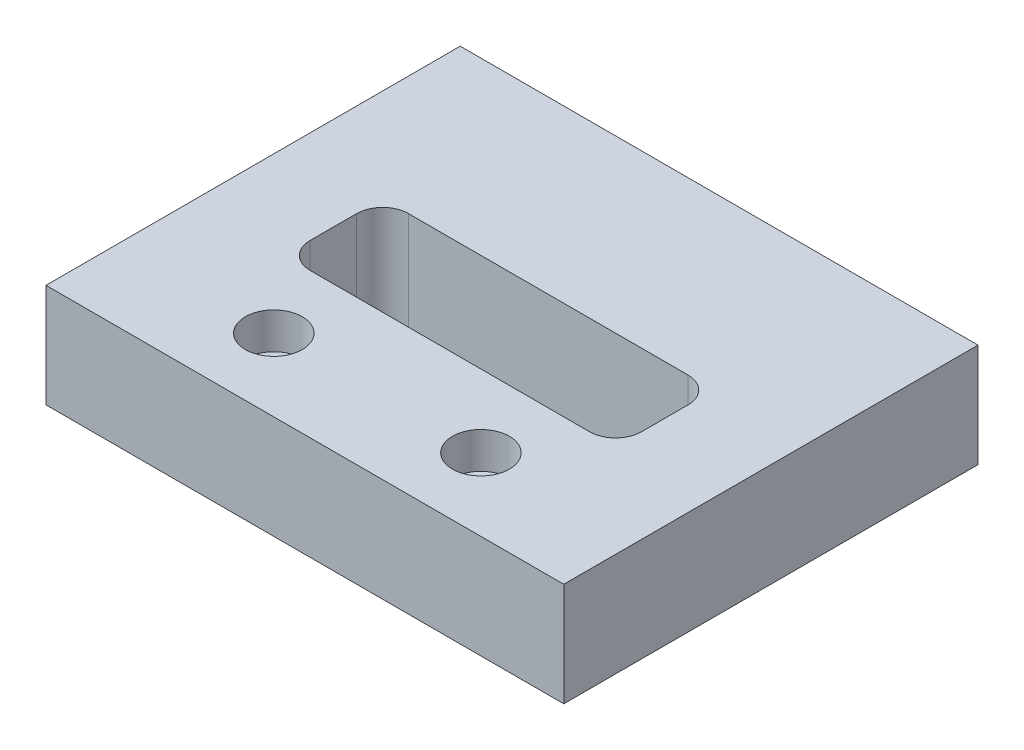
ISO-10303-21;
HEADER;
FILE_DESCRIPTION(('STEP AP214'),'2;1');
FILE_NAME('part.step','',(''),(''),'','','');
FILE_SCHEMA(('AUTOMOTIVE_DESIGN { 1 0 10303 214 1 1 1 1 }'));
ENDSEC;
DATA;
#1=APPLICATION_CONTEXT('core data for automotive mechanical design processes');
#2=APPLICATION_PROTOCOL_DEFINITION('international standard','automotive_design',2000,#1);
#3=PRODUCT_CONTEXT('',#1,'mechanical');
#4=PRODUCT('Part','Part','',(#3));
#5=PRODUCT_RELATED_PRODUCT_CATEGORY('part','',(#4));
#6=PRODUCT_DEFINITION_FORMATION('','',#4);
#7=PRODUCT_DEFINITION_CONTEXT('part definition',#1,'design');
#8=PRODUCT_DEFINITION('design','',#6,#7);
#9=PRODUCT_DEFINITION_SHAPE('','',#8);
#10=(LENGTH_UNIT() NAMED_UNIT(*) SI_UNIT(.MILLI.,.METRE.));
#11=(NAMED_UNIT(*) PLANE_ANGLE_UNIT() SI_UNIT($,.RADIAN.));
#12=(NAMED_UNIT(*) SI_UNIT($,.STERADIAN.) SOLID_ANGLE_UNIT());
#13=UNCERTAINTY_MEASURE_WITH_UNIT(LENGTH_MEASURE(1.E-05),#10,'distance_accuracy_value','');
#14=(GEOMETRIC_REPRESENTATION_CONTEXT(3) GLOBAL_UNCERTAINTY_ASSIGNED_CONTEXT((#13)) GLOBAL_UNIT_ASSIGNED_CONTEXT((#10,
#11,#12)) REPRESENTATION_CONTEXT('',''));
#15=CARTESIAN_POINT('',(0.,0.,0.));
#16=DIRECTION('',(0.,0.,1.));
#17=DIRECTION('',(1.,0.,0.));
#18=AXIS2_PLACEMENT_3D('',#15,#16,#17);
#19=CARTESIAN_POINT('',(0.,20.,0.));
#20=DIRECTION('',(0.,-1.,0.));
#21=DIRECTION('',(0.,0.,-1.));
#22=AXIS2_PLACEMENT_3D('',#19,#20,#21);
#23=PLANE('',#22);
#24=CARTESIAN_POINT('',(20.,20.,26.));
#25=DIRECTION('',(0.,1.,0.));
#26=DIRECTION('',(0.,0.,1.));
#27=AXIS2_PLACEMENT_3D('',#24,#25,#26);
#28=CIRCLE('',#27,5.5);
#29=CARTESIAN_POINT('',(20.,20.,31.5));
#30=VERTEX_POINT('',#29);
#31=EDGE_CURVE('E308',#30,#30,#28,.T.);
#32=ORIENTED_EDGE('',*,*,#31,.F.);
#33=EDGE_LOOP('',(#32));
#34=FACE_BOUND('',#33,.T.);
#35=CARTESIAN_POINT('',(-20.,20.,26.));
#36=DIRECTION('',(0.,1.,0.));
#37=DIRECTION('',(0.,0.,1.));
#38=AXIS2_PLACEMENT_3D('',#35,#36,#37);
#39=CIRCLE('',#38,5.5);
#40=CARTESIAN_POINT('',(-20.,20.,31.5));
#41=VERTEX_POINT('',#40);
#42=EDGE_CURVE('E201',#41,#41,#39,.T.);
#43=ORIENTED_EDGE('',*,*,#42,.F.);
#44=EDGE_LOOP('',(#43));
#45=FACE_BOUND('',#44,.T.);
#46=DIRECTION('',(0.,0.,-1.));
#47=VECTOR('',#46,1.);
#48=CARTESIAN_POINT('',(50.,20.,40.));
#49=LINE('',#48,#47);
#50=CARTESIAN_POINT('',(50.,20.,40.));
#51=VERTEX_POINT('',#50);
#52=CARTESIAN_POINT('',(50.,20.,-40.));
#53=VERTEX_POINT('',#52);
#54=EDGE_CURVE('E137',#51,#53,#49,.T.);
#55=ORIENTED_EDGE('',*,*,#54,.T.);
#56=DIRECTION('',(-1.,0.,0.));
#57=VECTOR('',#56,1.);
#58=CARTESIAN_POINT('',(-50.,20.,-40.));
#59=LINE('',#58,#57);
#60=CARTESIAN_POINT('',(-50.,20.,-40.));
#61=VERTEX_POINT('',#60);
#62=EDGE_CURVE('E126',#53,#61,#59,.T.);
#63=ORIENTED_EDGE('',*,*,#62,.T.);
#64=DIRECTION('',(0.,0.,1.));
#65=VECTOR('',#64,1.);
#66=CARTESIAN_POINT('',(-50.,20.,40.));
#67=LINE('',#66,#65);
#68=CARTESIAN_POINT('',(-50.,20.,40.));
#69=VERTEX_POINT('',#68);
#70=EDGE_CURVE('E136',#61,#69,#67,.T.);
#71=ORIENTED_EDGE('',*,*,#70,.T.);
#72=DIRECTION('',(1.,0.,0.));
#73=VECTOR('',#72,1.);
#74=CARTESIAN_POINT('',(-50.,20.,40.));
#75=LINE('',#74,#73);
#76=EDGE_CURVE('E141',#69,#51,#75,.T.);
#77=ORIENTED_EDGE('',*,*,#76,.T.);
#78=EDGE_LOOP('',(#55,#63,#71,#77));
#79=FACE_BOUND('',#78,.T.);
#80=DIRECTION('',(0.,0.,1.));
#81=VECTOR('',#80,1.);
#82=CARTESIAN_POINT('',(-32.,20.,12.));
#83=LINE('',#82,#81);
#84=CARTESIAN_POINT('',(-32.,20.,-2.));
#85=VERTEX_POINT('',#84);
#86=CARTESIAN_POINT('',(-32.,20.,7.));
#87=VERTEX_POINT('',#86);
#88=EDGE_CURVE('E205',#85,#87,#83,.T.);
#89=ORIENTED_EDGE('',*,*,#88,.F.);
#90=CARTESIAN_POINT('',(-27.,20.,-2.));
#91=DIRECTION('',(0.,-1.,0.));
#92=DIRECTION('',(0.,0.,-1.));
#93=AXIS2_PLACEMENT_3D('',#90,#91,#92);
#94=CIRCLE('',#93,5.);
#95=CARTESIAN_POINT('',(-27.,20.,-7.));
#96=VERTEX_POINT('',#95);
#97=EDGE_CURVE('E11',#85,#96,#94,.T.);
#98=ORIENTED_EDGE('',*,*,#97,.T.);
#99=DIRECTION('',(-1.,0.,0.));
#100=VECTOR('',#99,1.);
#101=CARTESIAN_POINT('',(-32.,20.,-7.));
#102=LINE('',#101,#100);
#103=CARTESIAN_POINT('',(27.,20.,-7.));
#104=VERTEX_POINT('',#103);
#105=EDGE_CURVE('E215',#104,#96,#102,.T.);
#106=ORIENTED_EDGE('',*,*,#105,.F.);
#107=CARTESIAN_POINT('',(27.,20.,-2.));
#108=DIRECTION('',(0.,-1.,0.));
#109=DIRECTION('',(0.,0.,-1.));
#110=AXIS2_PLACEMENT_3D('',#107,#108,#109);
#111=CIRCLE('',#110,5.);
#112=CARTESIAN_POINT('',(32.,20.,-2.));
#113=VERTEX_POINT('',#112);
#114=EDGE_CURVE('E184',#104,#113,#111,.T.);
#115=ORIENTED_EDGE('',*,*,#114,.T.);
#116=DIRECTION('',(0.,0.,-1.));
#117=VECTOR('',#116,1.);
#118=CARTESIAN_POINT('',(32.,20.,12.));
#119=LINE('',#118,#117);
#120=CARTESIAN_POINT('',(32.,20.,7.));
#121=VERTEX_POINT('',#120);
#122=EDGE_CURVE('E212',#121,#113,#119,.T.);
#123=ORIENTED_EDGE('',*,*,#122,.F.);
#124=CARTESIAN_POINT('',(27.,20.,7.));
#125=DIRECTION('',(0.,-1.,0.));
#126=DIRECTION('',(0.,0.,-1.));
#127=AXIS2_PLACEMENT_3D('',#124,#125,#126);
#128=CIRCLE('',#127,5.);
#129=CARTESIAN_POINT('',(27.,20.,12.));
#130=VERTEX_POINT('',#129);
#131=EDGE_CURVE('E176',#121,#130,#128,.T.);
#132=ORIENTED_EDGE('',*,*,#131,.T.);
#133=DIRECTION('',(1.,0.,0.));
#134=VECTOR('',#133,1.);
#135=CARTESIAN_POINT('',(-32.,20.,12.));
#136=LINE('',#135,#134);
#137=CARTESIAN_POINT('',(-27.,20.,12.));
#138=VERTEX_POINT('',#137);
#139=EDGE_CURVE('E208',#138,#130,#136,.T.);
#140=ORIENTED_EDGE('',*,*,#139,.F.);
#141=CARTESIAN_POINT('',(-27.,20.,7.));
#142=DIRECTION('',(0.,-1.,0.));
#143=DIRECTION('',(0.,0.,-1.));
#144=AXIS2_PLACEMENT_3D('',#141,#142,#143);
#145=CIRCLE('',#144,5.);
#146=EDGE_CURVE('E180',#138,#87,#145,.T.);
#147=ORIENTED_EDGE('',*,*,#146,.T.);
#148=EDGE_LOOP('',(#89,#98,#106,#115,#123,#132,#140,#147));
#149=FACE_BOUND('',#148,.T.);
#150=ADVANCED_FACE('F35',(#34,#45,#79,#149),#23,.F.);
#151=CARTESIAN_POINT('',(0.,0.,0.));
#152=DIRECTION('',(0.,-1.,0.));
#153=DIRECTION('',(0.,0.,-1.));
#154=AXIS2_PLACEMENT_3D('',#151,#152,#153);
#155=PLANE('',#154);
#156=CARTESIAN_POINT('',(20.,0.,26.));
#157=DIRECTION('',(0.,-1.,0.));
#158=DIRECTION('',(0.,0.,-1.));
#159=AXIS2_PLACEMENT_3D('',#156,#157,#158);
#160=CIRCLE('',#159,3.20000000000001);
#161=CARTESIAN_POINT('',(20.,0.,22.8));
#162=VERTEX_POINT('',#161);
#163=EDGE_CURVE('E39',#162,#162,#160,.T.);
#164=ORIENTED_EDGE('',*,*,#163,.F.);
#165=EDGE_LOOP('',(#164));
#166=FACE_BOUND('',#165,.T.);
#167=CARTESIAN_POINT('',(-20.,0.,26.));
#168=DIRECTION('',(0.,-1.,0.));
#169=DIRECTION('',(0.,0.,-1.));
#170=AXIS2_PLACEMENT_3D('',#167,#168,#169);
#171=CIRCLE('',#170,3.20000000000001);
#172=CARTESIAN_POINT('',(-20.,0.,22.8));
#173=VERTEX_POINT('',#172);
#174=EDGE_CURVE('E186',#173,#173,#171,.T.);
#175=ORIENTED_EDGE('',*,*,#174,.F.);
#176=EDGE_LOOP('',(#175));
#177=FACE_BOUND('',#176,.T.);
#178=DIRECTION('',(0.,0.,-1.));
#179=VECTOR('',#178,1.);
#180=CARTESIAN_POINT('',(50.,0.,40.));
#181=LINE('',#180,#179);
#182=CARTESIAN_POINT('',(50.,0.,40.));
#183=VERTEX_POINT('',#182);
#184=CARTESIAN_POINT('',(50.,0.,-40.));
#185=VERTEX_POINT('',#184);
#186=EDGE_CURVE('E149',#183,#185,#181,.T.);
#187=ORIENTED_EDGE('',*,*,#186,.F.);
#188=DIRECTION('',(1.,0.,0.));
#189=VECTOR('',#188,1.);
#190=CARTESIAN_POINT('',(-50.,0.,40.));
#191=LINE('',#190,#189);
#192=CARTESIAN_POINT('',(-50.,0.,40.));
#193=VERTEX_POINT('',#192);
#194=EDGE_CURVE('E145',#193,#183,#191,.T.);
#195=ORIENTED_EDGE('',*,*,#194,.F.);
#196=DIRECTION('',(0.,0.,1.));
#197=VECTOR('',#196,1.);
#198=CARTESIAN_POINT('',(-50.,0.,40.));
#199=LINE('',#198,#197);
#200=CARTESIAN_POINT('',(-50.,0.,-40.));
#201=VERTEX_POINT('',#200);
#202=EDGE_CURVE('E230',#201,#193,#199,.T.);
#203=ORIENTED_EDGE('',*,*,#202,.F.);
#204=DIRECTION('',(-1.,0.,0.));
#205=VECTOR('',#204,1.);
#206=CARTESIAN_POINT('',(-50.,0.,-40.));
#207=LINE('',#206,#205);
#208=EDGE_CURVE('E228',#185,#201,#207,.T.);
#209=ORIENTED_EDGE('',*,*,#208,.F.);
#210=EDGE_LOOP('',(#187,#195,#203,#209));
#211=FACE_BOUND('',#210,.T.);
#212=DIRECTION('',(0.,0.,-1.));
#213=VECTOR('',#212,1.);
#214=CARTESIAN_POINT('',(32.,0.,12.));
#215=LINE('',#214,#213);
#216=CARTESIAN_POINT('',(32.,0.,7.));
#217=VERTEX_POINT('',#216);
#218=CARTESIAN_POINT('',(32.,0.,-2.));
#219=VERTEX_POINT('',#218);
#220=EDGE_CURVE('E219',#217,#219,#215,.T.);
#221=ORIENTED_EDGE('',*,*,#220,.T.);
#222=CARTESIAN_POINT('',(27.,0.,-2.));
#223=DIRECTION('',(0.,-1.,0.));
#224=DIRECTION('',(0.,0.,-1.));
#225=AXIS2_PLACEMENT_3D('',#222,#223,#224);
#226=CIRCLE('',#225,5.);
#227=CARTESIAN_POINT('',(27.,0.,-7.));
#228=VERTEX_POINT('',#227);
#229=EDGE_CURVE('E182',#219,#228,#226,.F.);
#230=ORIENTED_EDGE('',*,*,#229,.T.);
#231=DIRECTION('',(-1.,0.,0.));
#232=VECTOR('',#231,1.);
#233=CARTESIAN_POINT('',(-32.,0.,-7.));
#234=LINE('',#233,#232);
#235=CARTESIAN_POINT('',(-27.,0.,-7.));
#236=VERTEX_POINT('',#235);
#237=EDGE_CURVE('E209',#228,#236,#234,.T.);
#238=ORIENTED_EDGE('',*,*,#237,.T.);
#239=CARTESIAN_POINT('',(-27.,0.,-2.));
#240=DIRECTION('',(0.,-1.,0.));
#241=DIRECTION('',(0.,0.,-1.));
#242=AXIS2_PLACEMENT_3D('',#239,#240,#241);
#243=CIRCLE('',#242,5.);
#244=CARTESIAN_POINT('',(-32.,0.,-2.));
#245=VERTEX_POINT('',#244);
#246=EDGE_CURVE('E44',#236,#245,#243,.F.);
#247=ORIENTED_EDGE('',*,*,#246,.T.);
#248=DIRECTION('',(0.,0.,1.));
#249=VECTOR('',#248,1.);
#250=CARTESIAN_POINT('',(-32.,0.,12.));
#251=LINE('',#250,#249);
#252=CARTESIAN_POINT('',(-32.,0.,7.));
#253=VERTEX_POINT('',#252);
#254=EDGE_CURVE('E188',#245,#253,#251,.T.);
#255=ORIENTED_EDGE('',*,*,#254,.T.);
#256=CARTESIAN_POINT('',(-27.,0.,7.));
#257=DIRECTION('',(0.,-1.,0.));
#258=DIRECTION('',(0.,0.,-1.));
#259=AXIS2_PLACEMENT_3D('',#256,#257,#258);
#260=CIRCLE('',#259,5.);
#261=CARTESIAN_POINT('',(-27.,0.,12.));
#262=VERTEX_POINT('',#261);
#263=EDGE_CURVE('E178',#253,#262,#260,.F.);
#264=ORIENTED_EDGE('',*,*,#263,.T.);
#265=DIRECTION('',(1.,0.,0.));
#266=VECTOR('',#265,1.);
#267=CARTESIAN_POINT('',(-32.,0.,12.));
#268=LINE('',#267,#266);
#269=CARTESIAN_POINT('',(27.,0.,12.));
#270=VERTEX_POINT('',#269);
#271=EDGE_CURVE('E193',#262,#270,#268,.T.);
#272=ORIENTED_EDGE('',*,*,#271,.T.);
#273=CARTESIAN_POINT('',(27.,0.,7.));
#274=DIRECTION('',(0.,-1.,0.));
#275=DIRECTION('',(0.,0.,-1.));
#276=AXIS2_PLACEMENT_3D('',#273,#274,#275);
#277=CIRCLE('',#276,5.);
#278=EDGE_CURVE('E174',#270,#217,#277,.F.);
#279=ORIENTED_EDGE('',*,*,#278,.T.);
#280=EDGE_LOOP('',(#221,#230,#238,#247,#255,#264,#272,#279));
#281=FACE_BOUND('',#280,.T.);
#282=ADVANCED_FACE('F241',(#166,#177,#211,#281),#155,.T.);
#283=CARTESIAN_POINT('',(50.,20.,40.));
#284=DIRECTION('',(-1.,0.,0.));
#285=DIRECTION('',(0.,0.,1.));
#286=AXIS2_PLACEMENT_3D('',#283,#284,#285);
#287=PLANE('',#286);
#288=ORIENTED_EDGE('',*,*,#186,.T.);
#289=DIRECTION('',(0.,-1.,0.));
#290=VECTOR('',#289,1.);
#291=CARTESIAN_POINT('',(50.,20.,-40.));
#292=LINE('',#291,#290);
#293=EDGE_CURVE('E130',#53,#185,#292,.T.);
#294=ORIENTED_EDGE('',*,*,#293,.F.);
#295=ORIENTED_EDGE('',*,*,#54,.F.);
#296=DIRECTION('',(0.,-1.,0.));
#297=VECTOR('',#296,1.);
#298=CARTESIAN_POINT('',(50.,20.,40.));
#299=LINE('',#298,#297);
#300=EDGE_CURVE('E226',#51,#183,#299,.T.);
#301=ORIENTED_EDGE('',*,*,#300,.T.);
#302=EDGE_LOOP('',(#288,#294,#295,#301));
#303=FACE_BOUND('',#302,.T.);
#304=ADVANCED_FACE('F147',(#303),#287,.F.);
#305=CARTESIAN_POINT('',(-50.,20.,-40.));
#306=DIRECTION('',(0.,0.,1.));
#307=DIRECTION('',(1.,0.,0.));
#308=AXIS2_PLACEMENT_3D('',#305,#306,#307);
#309=PLANE('',#308);
#310=ORIENTED_EDGE('',*,*,#208,.T.);
#311=DIRECTION('',(0.,-1.,0.));
#312=VECTOR('',#311,1.);
#313=CARTESIAN_POINT('',(-50.,20.,-40.));
#314=LINE('',#313,#312);
#315=EDGE_CURVE('E133',#61,#201,#314,.T.);
#316=ORIENTED_EDGE('',*,*,#315,.F.);
#317=ORIENTED_EDGE('',*,*,#62,.F.);
#318=ORIENTED_EDGE('',*,*,#293,.T.);
#319=EDGE_LOOP('',(#310,#316,#317,#318));
#320=FACE_BOUND('',#319,.T.);
#321=ADVANCED_FACE('F128',(#320),#309,.F.);
#322=CARTESIAN_POINT('',(-50.,20.,40.));
#323=DIRECTION('',(1.,0.,0.));
#324=DIRECTION('',(0.,0.,-1.));
#325=AXIS2_PLACEMENT_3D('',#322,#323,#324);
#326=PLANE('',#325);
#327=ORIENTED_EDGE('',*,*,#202,.T.);
#328=DIRECTION('',(0.,-1.,0.));
#329=VECTOR('',#328,1.);
#330=CARTESIAN_POINT('',(-50.,20.,40.));
#331=LINE('',#330,#329);
#332=EDGE_CURVE('E154',#69,#193,#331,.T.);
#333=ORIENTED_EDGE('',*,*,#332,.F.);
#334=ORIENTED_EDGE('',*,*,#70,.F.);
#335=ORIENTED_EDGE('',*,*,#315,.T.);
#336=EDGE_LOOP('',(#327,#333,#334,#335));
#337=FACE_BOUND('',#336,.T.);
#338=ADVANCED_FACE('F243',(#337),#326,.F.);
#339=CARTESIAN_POINT('',(-50.,20.,40.));
#340=DIRECTION('',(0.,0.,-1.));
#341=DIRECTION('',(-1.,0.,0.));
#342=AXIS2_PLACEMENT_3D('',#339,#340,#341);
#343=PLANE('',#342);
#344=ORIENTED_EDGE('',*,*,#194,.T.);
#345=ORIENTED_EDGE('',*,*,#300,.F.);
#346=ORIENTED_EDGE('',*,*,#76,.F.);
#347=ORIENTED_EDGE('',*,*,#332,.T.);
#348=EDGE_LOOP('',(#344,#345,#346,#347));
#349=FACE_BOUND('',#348,.T.);
#350=ADVANCED_FACE('F237',(#349),#343,.F.);
#351=CARTESIAN_POINT('',(-32.,20.,12.));
#352=DIRECTION('',(1.,0.,0.));
#353=DIRECTION('',(0.,0.,-1.));
#354=AXIS2_PLACEMENT_3D('',#351,#352,#353);
#355=PLANE('',#354);
#356=ORIENTED_EDGE('',*,*,#88,.T.);
#357=DIRECTION('',(0.,-1.,0.));
#358=VECTOR('',#357,1.);
#359=CARTESIAN_POINT('',(-32.,0.,7.));
#360=LINE('',#359,#358);
#361=EDGE_CURVE('E167',#87,#253,#360,.T.);
#362=ORIENTED_EDGE('',*,*,#361,.T.);
#363=ORIENTED_EDGE('',*,*,#254,.F.);
#364=DIRECTION('',(0.,-1.,0.));
#365=VECTOR('',#364,1.);
#366=CARTESIAN_POINT('',(-32.,20.,-2.));
#367=LINE('',#366,#365);
#368=EDGE_CURVE('E165',#245,#85,#367,.F.);
#369=ORIENTED_EDGE('',*,*,#368,.T.);
#370=EDGE_LOOP('',(#356,#362,#363,#369));
#371=FACE_BOUND('',#370,.T.);
#372=ADVANCED_FACE('F250',(#371),#355,.T.);
#373=CARTESIAN_POINT('',(-32.,20.,12.));
#374=DIRECTION('',(0.,0.,-1.));
#375=DIRECTION('',(-1.,0.,0.));
#376=AXIS2_PLACEMENT_3D('',#373,#374,#375);
#377=PLANE('',#376);
#378=ORIENTED_EDGE('',*,*,#139,.T.);
#379=DIRECTION('',(0.,-1.,0.));
#380=VECTOR('',#379,1.);
#381=CARTESIAN_POINT('',(27.,0.,12.));
#382=LINE('',#381,#380);
#383=EDGE_CURVE('E152',#130,#270,#382,.T.);
#384=ORIENTED_EDGE('',*,*,#383,.T.);
#385=ORIENTED_EDGE('',*,*,#271,.F.);
#386=DIRECTION('',(0.,-1.,0.));
#387=VECTOR('',#386,1.);
#388=CARTESIAN_POINT('',(-27.,20.,12.));
#389=LINE('',#388,#387);
#390=EDGE_CURVE('E150',#262,#138,#389,.F.);
#391=ORIENTED_EDGE('',*,*,#390,.T.);
#392=EDGE_LOOP('',(#378,#384,#385,#391));
#393=FACE_BOUND('',#392,.T.);
#394=ADVANCED_FACE('F266',(#393),#377,.T.);
#395=CARTESIAN_POINT('',(32.,20.,12.));
#396=DIRECTION('',(-1.,0.,0.));
#397=DIRECTION('',(0.,0.,1.));
#398=AXIS2_PLACEMENT_3D('',#395,#396,#397);
#399=PLANE('',#398);
#400=ORIENTED_EDGE('',*,*,#220,.F.);
#401=DIRECTION('',(0.,-1.,0.));
#402=VECTOR('',#401,1.);
#403=CARTESIAN_POINT('',(32.,20.,7.));
#404=LINE('',#403,#402);
#405=EDGE_CURVE('E163',#217,#121,#404,.F.);
#406=ORIENTED_EDGE('',*,*,#405,.T.);
#407=ORIENTED_EDGE('',*,*,#122,.T.);
#408=DIRECTION('',(0.,-1.,0.));
#409=VECTOR('',#408,1.);
#410=CARTESIAN_POINT('',(32.,0.,-2.));
#411=LINE('',#410,#409);
#412=EDGE_CURVE('E160',#113,#219,#411,.T.);
#413=ORIENTED_EDGE('',*,*,#412,.T.);
#414=EDGE_LOOP('',(#400,#406,#407,#413));
#415=FACE_BOUND('',#414,.T.);
#416=ADVANCED_FACE('F270',(#415),#399,.T.);
#417=CARTESIAN_POINT('',(-32.,20.,-7.));
#418=DIRECTION('',(0.,0.,1.));
#419=DIRECTION('',(1.,0.,0.));
#420=AXIS2_PLACEMENT_3D('',#417,#418,#419);
#421=PLANE('',#420);
#422=ORIENTED_EDGE('',*,*,#237,.F.);
#423=DIRECTION('',(0.,-1.,0.));
#424=VECTOR('',#423,1.);
#425=CARTESIAN_POINT('',(27.,20.,-7.));
#426=LINE('',#425,#424);
#427=EDGE_CURVE('E57',#228,#104,#426,.F.);
#428=ORIENTED_EDGE('',*,*,#427,.T.);
#429=ORIENTED_EDGE('',*,*,#105,.T.);
#430=DIRECTION('',(0.,-1.,0.));
#431=VECTOR('',#430,1.);
#432=CARTESIAN_POINT('',(-27.,0.,-7.));
#433=LINE('',#432,#431);
#434=EDGE_CURVE('E170',#96,#236,#433,.T.);
#435=ORIENTED_EDGE('',*,*,#434,.T.);
#436=EDGE_LOOP('',(#422,#428,#429,#435));
#437=FACE_BOUND('',#436,.T.);
#438=ADVANCED_FACE('F274',(#437),#421,.T.);
#439=CARTESIAN_POINT('',(27.,20.,7.));
#440=DIRECTION('',(0.,1.,0.));
#441=DIRECTION('',(0.,0.,1.));
#442=AXIS2_PLACEMENT_3D('',#439,#440,#441);
#443=CYLINDRICAL_SURFACE('',#442,5.);
#444=ORIENTED_EDGE('',*,*,#131,.F.);
#445=ORIENTED_EDGE('',*,*,#405,.F.);
#446=ORIENTED_EDGE('',*,*,#278,.F.);
#447=ORIENTED_EDGE('',*,*,#383,.F.);
#448=EDGE_LOOP('',(#444,#445,#446,#447));
#449=FACE_BOUND('',#448,.T.);
#450=ADVANCED_FACE('F278',(#449),#443,.F.);
#451=CARTESIAN_POINT('',(-27.,20.,7.));
#452=DIRECTION('',(0.,1.,0.));
#453=DIRECTION('',(0.,0.,1.));
#454=AXIS2_PLACEMENT_3D('',#451,#452,#453);
#455=CYLINDRICAL_SURFACE('',#454,5.);
#456=ORIENTED_EDGE('',*,*,#146,.F.);
#457=ORIENTED_EDGE('',*,*,#390,.F.);
#458=ORIENTED_EDGE('',*,*,#263,.F.);
#459=ORIENTED_EDGE('',*,*,#361,.F.);
#460=EDGE_LOOP('',(#456,#457,#458,#459));
#461=FACE_BOUND('',#460,.T.);
#462=ADVANCED_FACE('F357',(#461),#455,.F.);
#463=CARTESIAN_POINT('',(27.,20.,-2.));
#464=DIRECTION('',(0.,1.,0.));
#465=DIRECTION('',(0.,0.,1.));
#466=AXIS2_PLACEMENT_3D('',#463,#464,#465);
#467=CYLINDRICAL_SURFACE('',#466,5.);
#468=ORIENTED_EDGE('',*,*,#114,.F.);
#469=ORIENTED_EDGE('',*,*,#427,.F.);
#470=ORIENTED_EDGE('',*,*,#229,.F.);
#471=ORIENTED_EDGE('',*,*,#412,.F.);
#472=EDGE_LOOP('',(#468,#469,#470,#471));
#473=FACE_BOUND('',#472,.T.);
#474=ADVANCED_FACE('F350',(#473),#467,.F.);
#475=CARTESIAN_POINT('',(-27.,20.,-2.));
#476=DIRECTION('',(0.,1.,0.));
#477=DIRECTION('',(0.,0.,1.));
#478=AXIS2_PLACEMENT_3D('',#475,#476,#477);
#479=CYLINDRICAL_SURFACE('',#478,5.);
#480=ORIENTED_EDGE('',*,*,#97,.F.);
#481=ORIENTED_EDGE('',*,*,#368,.F.);
#482=ORIENTED_EDGE('',*,*,#246,.F.);
#483=ORIENTED_EDGE('',*,*,#434,.F.);
#484=EDGE_LOOP('',(#480,#481,#482,#483));
#485=FACE_BOUND('',#484,.T.);
#486=ADVANCED_FACE('F37',(#485),#479,.F.);
#487=CARTESIAN_POINT('',(-20.,20.,26.));
#488=DIRECTION('',(0.,1.,0.));
#489=DIRECTION('',(0.,0.,1.));
#490=AXIS2_PLACEMENT_3D('',#487,#488,#489);
#491=CYLINDRICAL_SURFACE('',#490,3.20000000000001);
#492=ORIENTED_EDGE('',*,*,#174,.T.);
#493=EDGE_LOOP('',(#492));
#494=FACE_BOUND('',#493,.T.);
#495=CARTESIAN_POINT('',(-20.,13.,26.));
#496=DIRECTION('',(0.,1.,0.));
#497=DIRECTION('',(0.,0.,1.));
#498=AXIS2_PLACEMENT_3D('',#495,#496,#497);
#499=CIRCLE('',#498,3.20000000000001);
#500=CARTESIAN_POINT('',(-20.,13.,29.2));
#501=VERTEX_POINT('',#500);
#502=EDGE_CURVE('E189',#501,#501,#499,.T.);
#503=ORIENTED_EDGE('',*,*,#502,.T.);
#504=EDGE_LOOP('',(#503));
#505=FACE_BOUND('',#504,.T.);
#506=ADVANCED_FACE('F279',(#494,#505),#491,.F.);
#507=CARTESIAN_POINT('',(-16.8,13.,26.));
#508=DIRECTION('',(0.,-1.,0.));
#509=DIRECTION('',(0.,0.,-1.));
#510=AXIS2_PLACEMENT_3D('',#507,#508,#509);
#511=PLANE('',#510);
#512=ORIENTED_EDGE('',*,*,#502,.F.);
#513=EDGE_LOOP('',(#512));
#514=FACE_BOUND('',#513,.T.);
#515=CARTESIAN_POINT('',(-20.,13.,26.));
#516=DIRECTION('',(0.,1.,0.));
#517=DIRECTION('',(0.,0.,1.));
#518=AXIS2_PLACEMENT_3D('',#515,#516,#517);
#519=CIRCLE('',#518,5.5);
#520=CARTESIAN_POINT('',(-20.,13.,31.5));
#521=VERTEX_POINT('',#520);
#522=EDGE_CURVE('E196',#521,#521,#519,.T.);
#523=ORIENTED_EDGE('',*,*,#522,.T.);
#524=EDGE_LOOP('',(#523));
#525=FACE_BOUND('',#524,.T.);
#526=ADVANCED_FACE('F282',(#514,#525),#511,.F.);
#527=CARTESIAN_POINT('',(-20.,20.,26.));
#528=DIRECTION('',(0.,1.,0.));
#529=DIRECTION('',(0.,0.,1.));
#530=AXIS2_PLACEMENT_3D('',#527,#528,#529);
#531=CYLINDRICAL_SURFACE('',#530,5.5);
#532=ORIENTED_EDGE('',*,*,#522,.F.);
#533=EDGE_LOOP('',(#532));
#534=FACE_BOUND('',#533,.T.);
#535=ORIENTED_EDGE('',*,*,#42,.T.);
#536=EDGE_LOOP('',(#535));
#537=FACE_BOUND('',#536,.T.);
#538=ADVANCED_FACE('F285',(#534,#537),#531,.F.);
#539=CARTESIAN_POINT('',(20.,20.,26.));
#540=DIRECTION('',(0.,1.,0.));
#541=DIRECTION('',(0.,0.,1.));
#542=AXIS2_PLACEMENT_3D('',#539,#540,#541);
#543=CYLINDRICAL_SURFACE('',#542,3.20000000000001);
#544=ORIENTED_EDGE('',*,*,#163,.T.);
#545=EDGE_LOOP('',(#544));
#546=FACE_BOUND('',#545,.T.);
#547=CARTESIAN_POINT('',(20.,13.,26.));
#548=DIRECTION('',(0.,1.,0.));
#549=DIRECTION('',(0.,0.,1.));
#550=AXIS2_PLACEMENT_3D('',#547,#548,#549);
#551=CIRCLE('',#550,3.20000000000001);
#552=CARTESIAN_POINT('',(20.,13.,29.2));
#553=VERTEX_POINT('',#552);
#554=EDGE_CURVE('E310',#553,#553,#551,.T.);
#555=ORIENTED_EDGE('',*,*,#554,.T.);
#556=EDGE_LOOP('',(#555));
#557=FACE_BOUND('',#556,.T.);
#558=ADVANCED_FACE('F289',(#546,#557),#543,.F.);
#559=CARTESIAN_POINT('',(23.2,13.,26.));
#560=DIRECTION('',(0.,-1.,0.));
#561=DIRECTION('',(0.,0.,-1.));
#562=AXIS2_PLACEMENT_3D('',#559,#560,#561);
#563=PLANE('',#562);
#564=ORIENTED_EDGE('',*,*,#554,.F.);
#565=EDGE_LOOP('',(#564));
#566=FACE_BOUND('',#565,.T.);
#567=CARTESIAN_POINT('',(20.,13.,26.));
#568=DIRECTION('',(0.,1.,0.));
#569=DIRECTION('',(0.,0.,1.));
#570=AXIS2_PLACEMENT_3D('',#567,#568,#569);
#571=CIRCLE('',#570,5.5);
#572=CARTESIAN_POINT('',(20.,13.,31.5));
#573=VERTEX_POINT('',#572);
#574=EDGE_CURVE('E306',#573,#573,#571,.T.);
#575=ORIENTED_EDGE('',*,*,#574,.T.);
#576=EDGE_LOOP('',(#575));
#577=FACE_BOUND('',#576,.T.);
#578=ADVANCED_FACE('F293',(#566,#577),#563,.F.);
#579=CARTESIAN_POINT('',(20.,20.,26.));
#580=DIRECTION('',(0.,1.,0.));
#581=DIRECTION('',(0.,0.,1.));
#582=AXIS2_PLACEMENT_3D('',#579,#580,#581);
#583=CYLINDRICAL_SURFACE('',#582,5.5);
#584=ORIENTED_EDGE('',*,*,#574,.F.);
#585=EDGE_LOOP('',(#584));
#586=FACE_BOUND('',#585,.T.);
#587=ORIENTED_EDGE('',*,*,#31,.T.);
#588=EDGE_LOOP('',(#587));
#589=FACE_BOUND('',#588,.T.);
#590=ADVANCED_FACE('F297',(#586,#589),#583,.F.);
#591=CLOSED_SHELL('',(#150,#282,#304,#321,#338,#350,#372,#394,#416,#438,#450,#462,#474,#486,
#506,#526,#538,#558,#578,#590));
#592=MANIFOLD_SOLID_BREP('B2',#591);
#593=ADVANCED_BREP_SHAPE_REPRESENTATION('',(#18,#592),#14);
#594=SHAPE_DEFINITION_REPRESENTATION(#9,#593);
ENDSEC;
END-ISO-10303-21;
